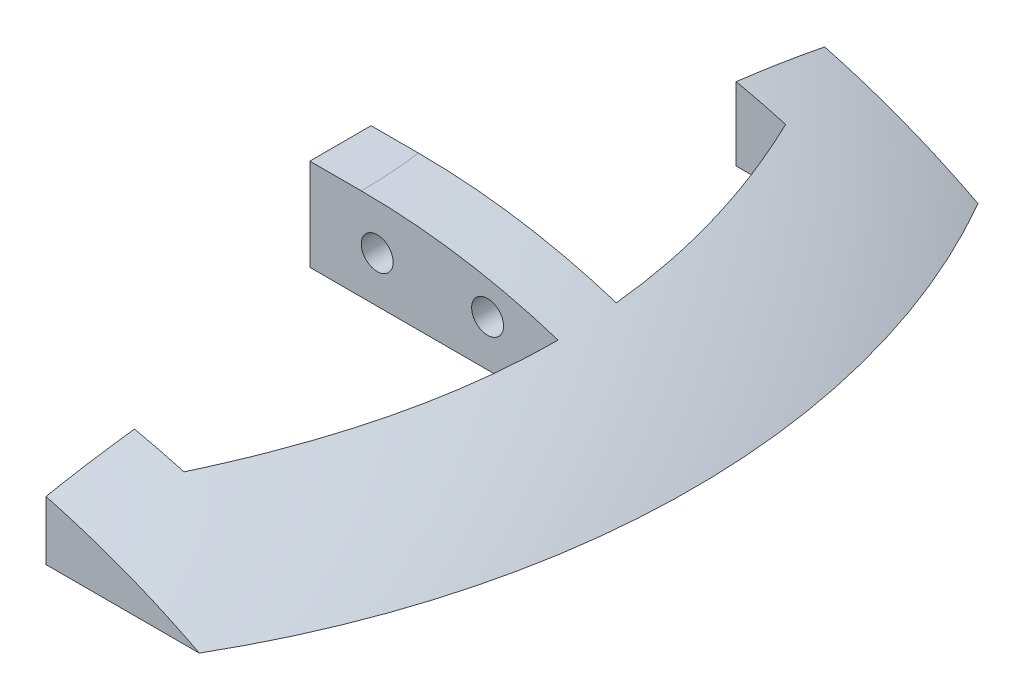
ISO-10303-21;
HEADER;
FILE_DESCRIPTION(('STEP AP214'),'2;1');
FILE_NAME('part.step','',(''),(''),'','','');
FILE_SCHEMA(('AUTOMOTIVE_DESIGN { 1 0 10303 214 1 1 1 1 }'));
ENDSEC;
DATA;
#1=APPLICATION_CONTEXT('core data for automotive mechanical design processes');
#2=APPLICATION_PROTOCOL_DEFINITION('international standard','automotive_design',2000,#1);
#3=PRODUCT_CONTEXT('',#1,'mechanical');
#4=PRODUCT('Part','Part','',(#3));
#5=PRODUCT_RELATED_PRODUCT_CATEGORY('part','',(#4));
#6=PRODUCT_DEFINITION_FORMATION('','',#4);
#7=PRODUCT_DEFINITION_CONTEXT('part definition',#1,'design');
#8=PRODUCT_DEFINITION('design','',#6,#7);
#9=PRODUCT_DEFINITION_SHAPE('','',#8);
#10=(LENGTH_UNIT() NAMED_UNIT(*) SI_UNIT(.MILLI.,.METRE.));
#11=(NAMED_UNIT(*) PLANE_ANGLE_UNIT() SI_UNIT($,.RADIAN.));
#12=(NAMED_UNIT(*) SI_UNIT($,.STERADIAN.) SOLID_ANGLE_UNIT());
#13=UNCERTAINTY_MEASURE_WITH_UNIT(LENGTH_MEASURE(1.E-05),#10,'distance_accuracy_value','');
#14=(GEOMETRIC_REPRESENTATION_CONTEXT(3) GLOBAL_UNCERTAINTY_ASSIGNED_CONTEXT((#13)) GLOBAL_UNIT_ASSIGNED_CONTEXT((#10,
#11,#12)) REPRESENTATION_CONTEXT('',''));
#15=CARTESIAN_POINT('',(0.,0.,0.));
#16=DIRECTION('',(0.,0.,1.));
#17=DIRECTION('',(1.,0.,0.));
#18=AXIS2_PLACEMENT_3D('',#15,#16,#17);
#19=CARTESIAN_POINT('',(84.9852262806236,7.5,-63.5000000000002));
#20=CARTESIAN_POINT('',(125.014773719376,7.5,0.));
#21=CARTESIAN_POINT('',(84.9852262806236,7.5,63.5000000000001));
#22=B_SPLINE_CURVE_WITH_KNOTS('',2,(#19,#20,#21),.UNSPECIFIED.,.F.,.F.,(3,3),(0.,1.),.UNSPECIFIED.);
#23=DIRECTION('',(0.,-1.,0.));
#24=VECTOR('',#23,1.);
#25=SURFACE_OF_LINEAR_EXTRUSION('',#22,#24);
#26=DIRECTION('',(0.,-1.,0.));
#27=VECTOR('',#26,1.);
#28=CARTESIAN_POINT('',(104.503632619015,7.5,-9.9999999999989));
#29=LINE('',#28,#27);
#30=CARTESIAN_POINT('',(104.503632619015,2.48441373684022,-9.9999999999989));
#31=VERTEX_POINT('',#30);
#32=CARTESIAN_POINT('',(104.503632619025,-7.5,-9.99999999999895));
#33=VERTEX_POINT('',#32);
#34=EDGE_CURVE('E151',#31,#33,#29,.T.);
#35=ORIENTED_EDGE('',*,*,#34,.F.);
#36=CARTESIAN_POINT('',(104.503632619015,2.48441373684022,-9.9999999999989));
#37=CARTESIAN_POINT('',(104.390389744491,2.48571221473044,-11.140998720779));
#38=CARTESIAN_POINT('',(104.257897177299,2.48718599004995,-12.2800663291533));
#39=CARTESIAN_POINT('',(103.955840658117,2.49030211867282,-14.5477913419774));
#40=CARTESIAN_POINT('',(103.78645513224,2.49194364108573,-15.6764725013471));
#41=CARTESIAN_POINT('',(103.411636465344,2.49522286994969,-17.9236105062914));
#42=CARTESIAN_POINT('',(103.206336499811,2.4968605686028,-19.0420895985374));
#43=CARTESIAN_POINT('',(102.760713583984,2.499922206327,-21.2690240618317));
#44=CARTESIAN_POINT('',(102.52048288119,2.50134668896419,-22.3774979102741));
#45=CARTESIAN_POINT('',(102.00597509761,2.50374974764146,-24.5846129565187));
#46=CARTESIAN_POINT('',(101.731753848475,2.50472904289542,-25.6832671823885));
#47=CARTESIAN_POINT('',(101.150208551283,2.50598656282114,-27.8709308051769));
#48=CARTESIAN_POINT('',(100.842908287548,2.5062652877487,-28.9599465306145));
#49=CARTESIAN_POINT('',(100.19636988574,2.50584663273234,-31.1276563387804));
#50=CARTESIAN_POINT('',(99.8571531585277,2.50514990286924,-32.2063568137616));
#51=CARTESIAN_POINT('',(99.1473966700136,2.50248841586823,-34.3546508875262));
#52=CARTESIAN_POINT('',(98.7768243402754,2.50052232586702,-35.4242337150406));
#53=CARTESIAN_POINT('',(98.0051363410381,2.49501070884452,-37.5545970072627));
#54=CARTESIAN_POINT('',(97.6039642706468,2.49146220383432,-38.6153570158611));
#55=CARTESIAN_POINT('',(96.7718142704585,2.48245652025253,-40.728365878104));
#56=CARTESIAN_POINT('',(96.3407598592072,2.47699428723105,-41.7805845679409));
#57=CARTESIAN_POINT('',(95.4495448489513,2.46381449411995,-43.8767824301222));
#58=CARTESIAN_POINT('',(94.9892910861479,2.45608939803481,-44.9207219020912));
#59=CARTESIAN_POINT('',(94.0403366346959,2.43801746232976,-47.0006402885018));
#60=CARTESIAN_POINT('',(93.5515291261471,2.42766021836603,-48.0365703963312));
#61=CARTESIAN_POINT('',(93.0499740227398,2.41582912009636,-49.0662432702595));
#62=B_SPLINE_CURVE_WITH_KNOTS('',3,(#36,#37,#38,#39,#40,#41,#42,#43,#44,#45,#46,#47,#48,#49,#50,
#51,#52,#53,#54,#55,#56,#57,#58,#59,#60,#61),.UNSPECIFIED.,.F.,.F.,(4,2,2,2,2,2,2,2,2,2,2,2,4),
(0.,3.43962300773555,6.86296634766363,10.2738746249455,13.6759334515574,17.0724764435548,
20.4665933783366,23.8584494186913,27.2538728070218,30.6557132777596,34.0666071192783,
37.4889919483117,40.9251210937083),.UNSPECIFIED.);
#63=CARTESIAN_POINT('',(93.0499740227399,2.4158291200964,-49.0662432702595));
#64=VERTEX_POINT('',#63);
#65=EDGE_CURVE('E196',#31,#64,#62,.T.);
#66=ORIENTED_EDGE('',*,*,#65,.T.);
#67=DIRECTION('',(0.,-1.,0.));
#68=VECTOR('',#67,1.);
#69=CARTESIAN_POINT('',(93.0499740227399,7.5,-49.0662432702595));
#70=LINE('',#69,#68);
#71=CARTESIAN_POINT('',(93.0499740227399,-7.5,-49.0662432702595));
#72=VERTEX_POINT('',#71);
#73=EDGE_CURVE('E257',#64,#72,#70,.T.);
#74=ORIENTED_EDGE('',*,*,#73,.T.);
#75=CARTESIAN_POINT('',(84.9852262806236,-7.5,-63.5000000000002));
#76=CARTESIAN_POINT('',(125.014773719376,-7.5,0.));
#77=CARTESIAN_POINT('',(84.9852262806236,-7.5,63.5000000000001));
#78=B_SPLINE_CURVE_WITH_KNOTS('',2,(#75,#76,#77),.UNSPECIFIED.,.F.,.F.,(3,3),(0.,1.),.UNSPECIFIED.);
#79=EDGE_CURVE('E277',#72,#33,#78,.T.);
#80=ORIENTED_EDGE('',*,*,#79,.T.);
#81=EDGE_LOOP('',(#35,#66,#74,#80));
#82=FACE_BOUND('',#81,.T.);
#83=ADVANCED_FACE('F43',(#82),#25,.F.);
#84=DIRECTION('',(0.,-1.,0.));
#85=VECTOR('',#84,1.);
#86=CARTESIAN_POINT('',(93.0499740227398,7.5,49.0662432702595));
#87=LINE('',#86,#85);
#88=CARTESIAN_POINT('',(93.0499740227398,2.41582912009641,49.0662432702595));
#89=VERTEX_POINT('',#88);
#90=CARTESIAN_POINT('',(93.0499740227398,-7.5,49.0662432702595));
#91=VERTEX_POINT('',#90);
#92=EDGE_CURVE('E259',#89,#91,#87,.T.);
#93=ORIENTED_EDGE('',*,*,#92,.F.);
#94=CARTESIAN_POINT('',(93.0499740227398,2.41582912009641,49.0662432702595));
#95=CARTESIAN_POINT('',(93.6533334452972,2.43006078895857,47.8275793431461));
#96=CARTESIAN_POINT('',(94.2382480620184,2.44216087762938,46.5798405828114));
#97=CARTESIAN_POINT('',(95.3700498328671,2.46270890973189,44.0643802169757));
#98=CARTESIAN_POINT('',(95.9168631098815,2.47114991512123,42.7966253328832));
#99=CARTESIAN_POINT('',(96.9696495326401,2.48494964981436,40.2424759308078));
#100=CARTESIAN_POINT('',(97.4755737741321,2.49030473384929,38.9560612012887));
#101=CARTESIAN_POINT('',(98.4439232559506,2.49849903994121,36.3660466746762));
#102=CARTESIAN_POINT('',(98.9063219196584,2.50133673367925,35.062436925071));
#103=CARTESIAN_POINT('',(99.7851443932491,2.50505262724196,32.4395457150232));
#104=CARTESIAN_POINT('',(100.201560578736,2.50593050256974,31.1202616956631));
#105=CARTESIAN_POINT('',(100.977648032057,2.50625709858714,28.4963387879553));
#106=CARTESIAN_POINT('',(101.338358373259,2.50573655518803,27.1920075365103));
#107=CARTESIAN_POINT('',(102.01163776609,2.50379977074594,24.5715754276408));
#108=CARTESIAN_POINT('',(102.324228003885,2.50238392529426,23.2554800213073));
#109=CARTESIAN_POINT('',(102.899576220004,2.49908378246816,20.6131872808588));
#110=CARTESIAN_POINT('',(103.16236172735,2.49719974522057,19.2869959513216));
#111=CARTESIAN_POINT('',(103.636661331644,2.49333782082038,16.6262495027311));
#112=CARTESIAN_POINT('',(103.848204331159,2.4913599873285,15.291699536076));
#113=CARTESIAN_POINT('',(104.218849596912,2.48762345191795,12.615949320621));
#114=CARTESIAN_POINT('',(104.377977753417,2.48586464208056,11.2747526882577));
#115=CARTESIAN_POINT('',(104.564534661689,2.4837106540263,9.38251039492222));
#116=CARTESIAN_POINT('',(104.614171788723,2.48312446575515,8.83358145136929));
#117=CARTESIAN_POINT('',(104.704517405748,2.48204046995378,7.73502640837808));
#118=CARTESIAN_POINT('',(104.745226626619,2.48154265518952,7.18540036971517));
#119=CARTESIAN_POINT('',(104.81767476036,2.48064617639166,6.08558269886346));
#120=CARTESIAN_POINT('',(104.849414053471,2.48024750815527,5.53539109164214));
#121=CARTESIAN_POINT('',(104.904039434714,2.47955562196695,4.43157157839854));
#122=CARTESIAN_POINT('',(104.926876493352,2.47926298861255,3.87794124135134));
#123=CARTESIAN_POINT('',(104.963426627302,2.47879242452521,2.77035736398427));
#124=CARTESIAN_POINT('',(104.977139338215,2.47861449837334,2.21640381164034));
#125=CARTESIAN_POINT('',(104.995427287465,2.47837649250804,1.10830026490391));
#126=CARTESIAN_POINT('',(105.00000177317,2.47831642250138,0.554150258090255));
#127=CARTESIAN_POINT('',(105.,2.47831685823799,1.01307850997046E-12));
#128=B_SPLINE_CURVE_WITH_KNOTS('',3,(#94,#95,#96,#97,#98,#99,#100,#101,#102,#103,#104,#105,#106,
#107,#108,#109,#110,#111,#112,#113,#114,#115,#116,#117,#118,#119,#120,#121,#122,#123,#124,#125,
#126,#127),.UNSPECIFIED.,.F.,.F.,(4,2,2,2,2,2,2,2,2,2,2,2,2,2,2,2,4),(0.,4.13355141038388,
8.27490658672612,12.4211437960752,16.5698964853992,20.7193360534659,24.7783251731021,
28.8355220710145,32.8904698152086,36.9431250734582,40.9937755136495,42.6472283266053,
44.3005457295538,45.9537930366418,47.6160212081274,49.2783157598877,50.9407472141019),.UNSPECIFIED.);
#129=CARTESIAN_POINT('',(104.99999999999,2.47831685824126,0.));
#130=VERTEX_POINT('',#129);
#131=EDGE_CURVE('E52',#89,#130,#128,.T.);
#132=ORIENTED_EDGE('',*,*,#131,.T.);
#133=DIRECTION('',(0.,-1.,0.));
#134=VECTOR('',#133,1.);
#135=CARTESIAN_POINT('',(104.99999999999,7.5,0.));
#136=LINE('',#135,#134);
#137=CARTESIAN_POINT('',(104.99999999999,-7.5,0.));
#138=VERTEX_POINT('',#137);
#139=EDGE_CURVE('E159',#130,#138,#136,.T.);
#140=ORIENTED_EDGE('',*,*,#139,.T.);
#141=EDGE_CURVE('E282',#138,#91,#78,.T.);
#142=ORIENTED_EDGE('',*,*,#141,.T.);
#143=EDGE_LOOP('',(#93,#132,#140,#142));
#144=FACE_BOUND('',#143,.T.);
#145=ADVANCED_FACE('F186',(#144),#25,.F.);
#146=CARTESIAN_POINT('',(0.,7.5,-63.5000000000003));
#147=DIRECTION('',(0.,0.,1.));
#148=DIRECTION('',(1.,0.,0.));
#149=AXIS2_PLACEMENT_3D('',#146,#147,#148);
#150=PLANE('',#149);
#151=DIRECTION('',(0.,-1.,0.));
#152=VECTOR('',#151,1.);
#153=CARTESIAN_POINT('',(84.9852262806236,7.5,-63.5000000000002));
#154=LINE('',#153,#152);
#155=CARTESIAN_POINT('',(84.9852262806236,2.12250484436396,-63.5000000000002));
#156=VERTEX_POINT('',#155);
#157=CARTESIAN_POINT('',(84.9852262806236,-7.5,-63.5000000000002));
#158=VERTEX_POINT('',#157);
#159=EDGE_CURVE('E253',#156,#158,#154,.T.);
#160=ORIENTED_EDGE('',*,*,#159,.F.);
#161=CARTESIAN_POINT('',(84.9852262806236,2.12250484436396,-63.5000000000002));
#162=CARTESIAN_POINT('',(86.0673435178037,1.83387649472302,-63.5000000000002));
#163=CARTESIAN_POINT('',(87.1458521247826,1.5316399665997,-63.5000000000002));
#164=CARTESIAN_POINT('',(89.2947643560905,0.89947032018981,-63.5000000000002));
#165=CARTESIAN_POINT('',(90.3651676592713,0.569536110661675,-63.5000000000002));
#166=CARTESIAN_POINT('',(92.493686156341,-0.11745042955623,-63.5000000000002));
#167=CARTESIAN_POINT('',(93.5518286487923,-0.474418099065195,-63.5000000000002));
#168=CARTESIAN_POINT('',(95.6581197445386,-1.21669464377797,-63.5000000000002));
#169=CARTESIAN_POINT('',(96.70626844441,-1.60200324479101,-63.5000000000002));
#170=CARTESIAN_POINT('',(98.7917850164171,-2.40132323332248,-63.5000000000002));
#171=CARTESIAN_POINT('',(99.8291509254306,-2.81533974570604,-63.5000000000002));
#172=CARTESIAN_POINT('',(101.891898950522,-3.67221892501526,-63.5000000000002));
#173=CARTESIAN_POINT('',(102.917281123695,-4.11508145444284,-63.5000000000002));
#174=CARTESIAN_POINT('',(104.958105420297,-5.03116641170143,-63.5000000000002));
#175=CARTESIAN_POINT('',(105.973508394399,-5.50447610679844,-63.5000000000002));
#176=CARTESIAN_POINT('',(107.990214429925,-6.48031504542773,-63.5000000000002));
#177=CARTESIAN_POINT('',(108.991517020692,-6.98284526145628,-63.5000000000002));
#178=CARTESIAN_POINT('',(109.985226280624,-7.49999999999998,-63.5000000000002));
#179=B_SPLINE_CURVE_WITH_KNOTS('',3,(#161,#162,#163,#164,#165,#166,#167,#168,#169,#170,#171,
#172,#173,#174,#175,#176,#177,#178),.UNSPECIFIED.,.F.,.F.,(4,2,2,2,2,2,2,2,4),(0.,
3.35978641277657,6.71970525760546,10.0695053903031,13.419273118862,16.7696403868939,
20.1199916861596,23.4804150042808,26.8409502256689),.UNSPECIFIED.);
#180=CARTESIAN_POINT('',(109.985226280624,-7.5,-63.5000000000002));
#181=VERTEX_POINT('',#180);
#182=EDGE_CURVE('E300',#156,#181,#179,.T.);
#183=ORIENTED_EDGE('',*,*,#182,.T.);
#184=DIRECTION('',(-1.,0.,0.));
#185=VECTOR('',#184,1.);
#186=CARTESIAN_POINT('',(0.,-7.5,-63.5000000000003));
#187=LINE('',#186,#185);
#188=EDGE_CURVE('E172',#181,#158,#187,.T.);
#189=ORIENTED_EDGE('',*,*,#188,.T.);
#190=EDGE_LOOP('',(#160,#183,#189));
#191=FACE_BOUND('',#190,.T.);
#192=ADVANCED_FACE('F298',(#191),#150,.F.);
#193=CARTESIAN_POINT('',(84.9852262806236,7.5,0.));
#194=DIRECTION('',(1.,0.,0.));
#195=DIRECTION('',(0.,0.,-1.));
#196=AXIS2_PLACEMENT_3D('',#193,#194,#195);
#197=PLANE('',#196);
#198=DIRECTION('',(0.,-1.,0.));
#199=VECTOR('',#198,1.);
#200=CARTESIAN_POINT('',(84.9852262806236,7.5,-49.0662432702595));
#201=LINE('',#200,#199);
#202=CARTESIAN_POINT('',(84.9852262806236,4.42725673668387,-49.0662432702595));
#203=VERTEX_POINT('',#202);
#204=CARTESIAN_POINT('',(84.9852262806236,-7.5,-49.0662432702595));
#205=VERTEX_POINT('',#204);
#206=EDGE_CURVE('E255',#203,#205,#201,.T.);
#207=ORIENTED_EDGE('',*,*,#206,.F.);
#208=CARTESIAN_POINT('',(84.9852262806236,4.42725673668387,-49.0662432702595));
#209=CARTESIAN_POINT('',(84.9852262806236,4.27767905395712,-50.2755226134372));
#210=CARTESIAN_POINT('',(84.9852262806236,4.11838221627253,-51.4836254858928));
#211=CARTESIAN_POINT('',(84.9852262806236,3.77903248572846,-53.8964901712186));
#212=CARTESIAN_POINT('',(84.9852262806236,3.59898665679471,-55.1012529789975));
#213=CARTESIAN_POINT('',(84.9852262806236,3.21671468476342,-57.5073141684525));
#214=CARTESIAN_POINT('',(84.9852262806236,3.0144877491762,-58.7086124247719));
#215=CARTESIAN_POINT('',(84.9852262806236,2.58648118719679,-61.1074220711234));
#216=CARTESIAN_POINT('',(84.9852262806236,2.36069358662157,-62.3049320367865));
#217=CARTESIAN_POINT('',(84.9852262806236,2.12250484436396,-63.5000000000002));
#218=B_SPLINE_CURVE_WITH_KNOTS('',3,(#208,#209,#210,#211,#212,#213,#214,#215,#216,#217),
.UNSPECIFIED.,.F.,.F.,(4,2,2,2,4),(0.,3.65548264269424,7.30972444448755,10.9640968480984,
14.6197101223374),.UNSPECIFIED.);
#219=EDGE_CURVE('E307',#203,#156,#218,.T.);
#220=ORIENTED_EDGE('',*,*,#219,.T.);
#221=ORIENTED_EDGE('',*,*,#159,.T.);
#222=DIRECTION('',(0.,0.,1.));
#223=VECTOR('',#222,1.);
#224=CARTESIAN_POINT('',(84.9852262806236,-7.5,0.));
#225=LINE('',#224,#223);
#226=EDGE_CURVE('E288',#158,#205,#225,.T.);
#227=ORIENTED_EDGE('',*,*,#226,.T.);
#228=EDGE_LOOP('',(#207,#220,#221,#227));
#229=FACE_BOUND('',#228,.T.);
#230=ADVANCED_FACE('F320',(#229),#197,.F.);
#231=CARTESIAN_POINT('',(0.,7.5,-49.0662432702595));
#232=DIRECTION('',(0.,0.,-1.));
#233=DIRECTION('',(-1.,0.,0.));
#234=AXIS2_PLACEMENT_3D('',#231,#232,#233);
#235=PLANE('',#234);
#236=ORIENTED_EDGE('',*,*,#73,.F.);
#237=CARTESIAN_POINT('',(93.0499740227399,2.4158291200964,-49.0662432702595));
#238=CARTESIAN_POINT('',(92.3837583995304,2.60620307928744,-49.0662432702595));
#239=CARTESIAN_POINT('',(91.7159055183498,2.79083871139055,-49.0662432702595));
#240=CARTESIAN_POINT('',(90.3773421753399,3.14866253226787,-49.0662432702595));
#241=CARTESIAN_POINT('',(89.7066325755399,3.32185394534205,-49.0662432702595));
#242=CARTESIAN_POINT('',(88.3623990805257,3.6569252783814,-49.0662432702595));
#243=CARTESIAN_POINT('',(87.6888752004986,3.81880525930444,-49.0662432702595));
#244=CARTESIAN_POINT('',(86.3390396332992,4.13139772850722,-49.0662432702595));
#245=CARTESIAN_POINT('',(85.6627272110417,4.28210704305838,-49.0662432702595));
#246=CARTESIAN_POINT('',(84.9852262806236,4.42725673668388,-49.0662432702595));
#247=B_SPLINE_CURVE_WITH_KNOTS('',3,(#237,#238,#239,#240,#241,#242,#243,#244,#245,#246),
.UNSPECIFIED.,.F.,.F.,(4,2,2,2,4),(0.,2.07861695613121,4.15664576247248,6.2346633693506,
8.31326912227673),.UNSPECIFIED.);
#248=EDGE_CURVE('E308',#64,#203,#247,.T.);
#249=ORIENTED_EDGE('',*,*,#248,.T.);
#250=ORIENTED_EDGE('',*,*,#206,.T.);
#251=DIRECTION('',(1.,0.,0.));
#252=VECTOR('',#251,1.);
#253=CARTESIAN_POINT('',(0.,-7.5,-49.0662432702595));
#254=LINE('',#253,#252);
#255=EDGE_CURVE('E283',#205,#72,#254,.T.);
#256=ORIENTED_EDGE('',*,*,#255,.T.);
#257=EDGE_LOOP('',(#236,#249,#250,#256));
#258=FACE_BOUND('',#257,.T.);
#259=ADVANCED_FACE('F191',(#258),#235,.F.);
#260=CARTESIAN_POINT('',(0.,7.5,49.0662432702593));
#261=DIRECTION('',(0.,0.,-1.));
#262=DIRECTION('',(-1.,0.,0.));
#263=AXIS2_PLACEMENT_3D('',#260,#261,#262);
#264=PLANE('',#263);
#265=DIRECTION('',(0.,-1.,0.));
#266=VECTOR('',#265,1.);
#267=CARTESIAN_POINT('',(84.9852262806237,7.5,49.0662432702595));
#268=LINE('',#267,#266);
#269=CARTESIAN_POINT('',(84.9852262806237,4.42725673668387,49.0662432702595));
#270=VERTEX_POINT('',#269);
#271=CARTESIAN_POINT('',(84.9852262806237,-7.5,49.0662432702595));
#272=VERTEX_POINT('',#271);
#273=EDGE_CURVE('E261',#270,#272,#268,.T.);
#274=ORIENTED_EDGE('',*,*,#273,.F.);
#275=CARTESIAN_POINT('',(84.9852262806237,4.42725673668387,49.0662432702595));
#276=CARTESIAN_POINT('',(85.6627272110418,4.28210704305837,49.0662432702595));
#277=CARTESIAN_POINT('',(86.3390396332993,4.13139772850722,49.0662432702595));
#278=CARTESIAN_POINT('',(87.6888752004986,3.81880525930444,49.0662432702595));
#279=CARTESIAN_POINT('',(88.3623990805257,3.6569252783814,49.0662432702595));
#280=CARTESIAN_POINT('',(89.7066325755399,3.32185394534205,49.0662432702595));
#281=CARTESIAN_POINT('',(90.3773421753399,3.14866253226787,49.0662432702595));
#282=CARTESIAN_POINT('',(91.7159055183498,2.79083871139056,49.0662432702595));
#283=CARTESIAN_POINT('',(92.3837583995304,2.60620307928744,49.0662432702595));
#284=CARTESIAN_POINT('',(93.0499740227398,2.41582912009641,49.0662432702595));
#285=B_SPLINE_CURVE_WITH_KNOTS('',3,(#275,#276,#277,#278,#279,#280,#281,#282,#283,#284),
.UNSPECIFIED.,.F.,.F.,(4,2,2,2,4),(0.,2.07860575292609,4.1566233598042,6.23465216614544,
8.31326912227662),.UNSPECIFIED.);
#286=EDGE_CURVE('E66',#270,#89,#285,.T.);
#287=ORIENTED_EDGE('',*,*,#286,.T.);
#288=ORIENTED_EDGE('',*,*,#92,.T.);
#289=DIRECTION('',(1.,0.,0.));
#290=VECTOR('',#289,1.);
#291=CARTESIAN_POINT('',(0.,-7.5,49.0662432702593));
#292=LINE('',#291,#290);
#293=EDGE_CURVE('E274',#272,#91,#292,.T.);
#294=ORIENTED_EDGE('',*,*,#293,.F.);
#295=EDGE_LOOP('',(#274,#287,#288,#294));
#296=FACE_BOUND('',#295,.T.);
#297=ADVANCED_FACE('F188',(#296),#264,.T.);
#298=CARTESIAN_POINT('',(84.9852262806238,7.5,1.63423419031503E-13));
#299=DIRECTION('',(-1.,0.,0.));
#300=DIRECTION('',(0.,0.,1.));
#301=AXIS2_PLACEMENT_3D('',#298,#299,#300);
#302=PLANE('',#301);
#303=DIRECTION('',(0.,-1.,0.));
#304=VECTOR('',#303,1.);
#305=CARTESIAN_POINT('',(84.9852262806236,7.5,63.5000000000001));
#306=LINE('',#305,#304);
#307=CARTESIAN_POINT('',(84.9852262806236,2.12250484436396,63.5000000000001));
#308=VERTEX_POINT('',#307);
#309=CARTESIAN_POINT('',(84.9852262806236,-7.5,63.5000000000001));
#310=VERTEX_POINT('',#309);
#311=EDGE_CURVE('E263',#308,#310,#306,.T.);
#312=ORIENTED_EDGE('',*,*,#311,.F.);
#313=CARTESIAN_POINT('',(84.9852262806236,2.12250484436396,63.5000000000001));
#314=CARTESIAN_POINT('',(84.9852262806236,2.36069358662157,62.3049320367864));
#315=CARTESIAN_POINT('',(84.9852262806236,2.58648118719679,61.1074220711234));
#316=CARTESIAN_POINT('',(84.9852262806236,3.0144877491762,58.7086124247719));
#317=CARTESIAN_POINT('',(84.9852262806236,3.21671468476343,57.5073141684525));
#318=CARTESIAN_POINT('',(84.9852262806236,3.59898665679471,55.1012529789975));
#319=CARTESIAN_POINT('',(84.9852262806237,3.77903248572845,53.8964901712186));
#320=CARTESIAN_POINT('',(84.9852262806237,4.11838221627251,51.4836254858928));
#321=CARTESIAN_POINT('',(84.9852262806237,4.27767905395708,50.2755226134372));
#322=CARTESIAN_POINT('',(84.9852262806237,4.42725673668385,49.0662432702595));
#323=B_SPLINE_CURVE_WITH_KNOTS('',3,(#313,#314,#315,#316,#317,#318,#319,#320,#321,#322),
.UNSPECIFIED.,.F.,.F.,(4,2,2,2,4),(0.,3.65561327423894,7.30998567784977,10.9642274796431,
14.6197101223373),.UNSPECIFIED.);
#324=EDGE_CURVE('E213',#308,#270,#323,.T.);
#325=ORIENTED_EDGE('',*,*,#324,.T.);
#326=ORIENTED_EDGE('',*,*,#273,.T.);
#327=DIRECTION('',(0.,0.,-1.));
#328=VECTOR('',#327,1.);
#329=CARTESIAN_POINT('',(84.9852262806238,-7.5,1.63423419031503E-13));
#330=LINE('',#329,#328);
#331=EDGE_CURVE('E271',#310,#272,#330,.T.);
#332=ORIENTED_EDGE('',*,*,#331,.F.);
#333=EDGE_LOOP('',(#312,#325,#326,#332));
#334=FACE_BOUND('',#333,.T.);
#335=ADVANCED_FACE('F226',(#334),#302,.T.);
#336=CARTESIAN_POINT('',(0.,7.5,63.5000000000001));
#337=DIRECTION('',(0.,0.,1.));
#338=DIRECTION('',(1.,0.,0.));
#339=AXIS2_PLACEMENT_3D('',#336,#337,#338);
#340=PLANE('',#339);
#341=DIRECTION('',(-1.,0.,0.));
#342=VECTOR('',#341,1.);
#343=CARTESIAN_POINT('',(0.,-7.5,63.5000000000001));
#344=LINE('',#343,#342);
#345=CARTESIAN_POINT('',(109.985226280624,-7.5,63.5000000000001));
#346=VERTEX_POINT('',#345);
#347=EDGE_CURVE('E268',#346,#310,#344,.T.);
#348=ORIENTED_EDGE('',*,*,#347,.F.);
#349=CARTESIAN_POINT('',(109.985226280624,-7.5,63.5000000000001));
#350=CARTESIAN_POINT('',(108.991517020692,-6.98284526145628,63.5000000000001));
#351=CARTESIAN_POINT('',(107.990214429925,-6.48031504542772,63.5000000000001));
#352=CARTESIAN_POINT('',(105.973508394399,-5.50447610679844,63.5000000000001));
#353=CARTESIAN_POINT('',(104.958105420297,-5.03116641170143,63.5000000000001));
#354=CARTESIAN_POINT('',(102.917281123695,-4.11508145444284,63.5000000000001));
#355=CARTESIAN_POINT('',(101.891898950523,-3.67221892501525,63.5000000000001));
#356=CARTESIAN_POINT('',(99.8291509254307,-2.81533974570604,63.5000000000001));
#357=CARTESIAN_POINT('',(98.7917850164171,-2.40132323332247,63.5000000000001));
#358=CARTESIAN_POINT('',(96.70626844441,-1.602003244791,63.5000000000001));
#359=CARTESIAN_POINT('',(95.6581197445386,-1.21669464377796,63.5000000000001));
#360=CARTESIAN_POINT('',(93.5518286487924,-0.474418099065187,63.5000000000001));
#361=CARTESIAN_POINT('',(92.4936861563411,-0.117450429556224,63.5000000000001));
#362=CARTESIAN_POINT('',(90.3651676592713,0.569536110661678,63.5000000000001));
#363=CARTESIAN_POINT('',(89.2947643560905,0.899470320189814,63.5000000000001));
#364=CARTESIAN_POINT('',(87.1458521247827,1.5316399665997,63.5000000000001));
#365=CARTESIAN_POINT('',(86.0673435178037,1.83387649472302,63.5000000000001));
#366=CARTESIAN_POINT('',(84.9852262806236,2.12250484436396,63.5000000000001));
#367=B_SPLINE_CURVE_WITH_KNOTS('',3,(#349,#350,#351,#352,#353,#354,#355,#356,#357,#358,#359,
#360,#361,#362,#363,#364,#365,#366),.UNSPECIFIED.,.F.,.F.,(4,2,2,2,2,2,2,2,4),(0.,
3.36053522138807,6.72095853950932,10.0713098387749,13.4216771068069,16.7714448353658,
20.1212449680634,23.4811638128923,26.8409502256689),.UNSPECIFIED.);
#368=EDGE_CURVE('E219',#346,#308,#367,.T.);
#369=ORIENTED_EDGE('',*,*,#368,.T.);
#370=ORIENTED_EDGE('',*,*,#311,.T.);
#371=EDGE_LOOP('',(#348,#369,#370));
#372=FACE_BOUND('',#371,.T.);
#373=ADVANCED_FACE('F229',(#372),#340,.T.);
#374=CARTESIAN_POINT('',(0.,7.5,0.));
#375=DIRECTION('',(0.,1.,0.));
#376=DIRECTION('',(0.,0.,1.));
#377=AXIS2_PLACEMENT_3D('',#374,#375,#376);
#378=PLANE('',#377);
#379=DIRECTION('',(1.,0.,0.));
#380=VECTOR('',#379,1.);
#381=CARTESIAN_POINT('',(0.,7.5,0.));
#382=LINE('',#381,#380);
#383=CARTESIAN_POINT('',(64.5036326190146,7.5,0.));
#384=VERTEX_POINT('',#383);
#385=CARTESIAN_POINT('',(72.9167308680401,7.50000000000001,0.));
#386=VERTEX_POINT('',#385);
#387=EDGE_CURVE('E157',#384,#386,#382,.T.);
#388=ORIENTED_EDGE('',*,*,#387,.T.);
#389=CARTESIAN_POINT('',(0.,7.50000000000001,0.));
#390=DIRECTION('',(0.,1.,0.));
#391=DIRECTION('',(0.,0.,1.));
#392=AXIS2_PLACEMENT_3D('',#389,#390,#391);
#393=CIRCLE('',#392,72.9167308680401);
#394=CARTESIAN_POINT('',(72.2277622558127,7.5,-9.99999999999979));
#395=VERTEX_POINT('',#394);
#396=EDGE_CURVE('E140',#386,#395,#393,.T.);
#397=ORIENTED_EDGE('',*,*,#396,.T.);
#398=DIRECTION('',(-1.,0.,0.));
#399=VECTOR('',#398,1.);
#400=CARTESIAN_POINT('',(2.77122075287345E-13,7.5,-10.0000000000018));
#401=LINE('',#400,#399);
#402=CARTESIAN_POINT('',(64.5036326190146,7.5,-10.));
#403=VERTEX_POINT('',#402);
#404=EDGE_CURVE('E132',#395,#403,#401,.T.);
#405=ORIENTED_EDGE('',*,*,#404,.T.);
#406=DIRECTION('',(0.,0.,1.));
#407=VECTOR('',#406,1.);
#408=CARTESIAN_POINT('',(64.5036326190146,7.5,0.));
#409=LINE('',#408,#407);
#410=EDGE_CURVE('E137',#403,#384,#409,.T.);
#411=ORIENTED_EDGE('',*,*,#410,.T.);
#412=EDGE_LOOP('',(#388,#397,#405,#411));
#413=FACE_BOUND('',#412,.T.);
#414=ADVANCED_FACE('F135',(#413),#378,.T.);
#415=CARTESIAN_POINT('',(0.,-7.5,0.));
#416=DIRECTION('',(0.,1.,0.));
#417=DIRECTION('',(0.,0.,1.));
#418=AXIS2_PLACEMENT_3D('',#415,#416,#417);
#419=PLANE('',#418);
#420=ORIENTED_EDGE('',*,*,#188,.F.);
#421=CARTESIAN_POINT('',(0.,-7.5,0.));
#422=DIRECTION('',(0.,1.,0.));
#423=DIRECTION('',(0.,0.,1.));
#424=AXIS2_PLACEMENT_3D('',#421,#422,#423);
#425=CIRCLE('',#424,127.);
#426=EDGE_CURVE('E265',#346,#181,#425,.T.);
#427=ORIENTED_EDGE('',*,*,#426,.F.);
#428=ORIENTED_EDGE('',*,*,#347,.T.);
#429=ORIENTED_EDGE('',*,*,#331,.T.);
#430=ORIENTED_EDGE('',*,*,#293,.T.);
#431=ORIENTED_EDGE('',*,*,#141,.F.);
#432=DIRECTION('',(1.,0.,0.));
#433=VECTOR('',#432,1.);
#434=CARTESIAN_POINT('',(0.,-7.5,0.));
#435=LINE('',#434,#433);
#436=CARTESIAN_POINT('',(64.5036326190146,-7.5,0.));
#437=VERTEX_POINT('',#436);
#438=EDGE_CURVE('E142',#437,#138,#435,.T.);
#439=ORIENTED_EDGE('',*,*,#438,.F.);
#440=DIRECTION('',(0.,0.,1.));
#441=VECTOR('',#440,1.);
#442=CARTESIAN_POINT('',(64.5036326190146,-7.5,0.));
#443=LINE('',#442,#441);
#444=CARTESIAN_POINT('',(64.5036326190146,-7.5,-10.));
#445=VERTEX_POINT('',#444);
#446=EDGE_CURVE('E164',#445,#437,#443,.T.);
#447=ORIENTED_EDGE('',*,*,#446,.F.);
#448=DIRECTION('',(-1.,0.,0.));
#449=VECTOR('',#448,1.);
#450=CARTESIAN_POINT('',(2.77122075287345E-13,-7.5,-10.0000000000018));
#451=LINE('',#450,#449);
#452=EDGE_CURVE('E148',#33,#445,#451,.T.);
#453=ORIENTED_EDGE('',*,*,#452,.F.);
#454=ORIENTED_EDGE('',*,*,#79,.F.);
#455=ORIENTED_EDGE('',*,*,#255,.F.);
#456=ORIENTED_EDGE('',*,*,#226,.F.);
#457=EDGE_LOOP('',(#420,#427,#428,#429,#430,#431,#439,#447,#453,#454,#455,#456));
#458=FACE_BOUND('',#457,.T.);
#459=ADVANCED_FACE('F235',(#458),#419,.F.);
#460=CARTESIAN_POINT('',(2.77122075287345E-13,7.5,-10.0000000000018));
#461=DIRECTION('',(0.,0.,1.));
#462=DIRECTION('',(1.,0.,0.));
#463=AXIS2_PLACEMENT_3D('',#460,#461,#462);
#464=PLANE('',#463);
#465=CARTESIAN_POINT('',(75.5036326190197,0.,-10.0000000000018));
#466=DIRECTION('',(0.,0.,-1.));
#467=DIRECTION('',(-1.,0.,0.));
#468=AXIS2_PLACEMENT_3D('',#465,#466,#467);
#469=CIRCLE('',#468,2.6);
#470=CARTESIAN_POINT('',(72.9036326190197,0.,-10.0000000000018));
#471=VERTEX_POINT('',#470);
#472=EDGE_CURVE('E477',#471,#471,#469,.T.);
#473=ORIENTED_EDGE('',*,*,#472,.F.);
#474=EDGE_LOOP('',(#473));
#475=FACE_BOUND('',#474,.T.);
#476=CARTESIAN_POINT('',(93.5036326190197,0.,-10.0000000000018));
#477=DIRECTION('',(0.,0.,-1.));
#478=DIRECTION('',(-1.,0.,0.));
#479=AXIS2_PLACEMENT_3D('',#476,#477,#478);
#480=CIRCLE('',#479,2.59999999999999);
#481=CARTESIAN_POINT('',(90.9036326190197,0.,-10.0000000000018));
#482=VERTEX_POINT('',#481);
#483=EDGE_CURVE('E478',#482,#482,#480,.T.);
#484=ORIENTED_EDGE('',*,*,#483,.F.);
#485=EDGE_LOOP('',(#484));
#486=FACE_BOUND('',#485,.T.);
#487=ORIENTED_EDGE('',*,*,#404,.F.);
#488=CARTESIAN_POINT('',(72.2277622558127,7.5,-9.99999999999979));
#489=CARTESIAN_POINT('',(73.5981994009112,7.50001894376804,-9.99999999999975));
#490=CARTESIAN_POINT('',(74.9686421986203,7.47367508134512,-9.99999999999972));
#491=CARTESIAN_POINT('',(77.7075025989519,7.36823016058402,-9.99999999999964));
#492=CARTESIAN_POINT('',(79.0759201917381,7.28912884684546,-9.9999999999996));
#493=CARTESIAN_POINT('',(81.8005713305475,7.07876352348843,-9.99999999999953));
#494=CARTESIAN_POINT('',(83.1568289886948,6.9478118693218,-9.99999999999949));
#495=CARTESIAN_POINT('',(85.863299864194,6.63384026109182,-9.99999999999941));
#496=CARTESIAN_POINT('',(87.2135131056773,6.45082051509132,-9.99999999999938));
#497=CARTESIAN_POINT('',(89.9059334497501,6.03288693093674,-9.9999999999993));
#498=CARTESIAN_POINT('',(91.2481402718086,5.79797128528236,-9.99999999999926));
#499=CARTESIAN_POINT('',(93.9224929645951,5.27652624760797,-9.99999999999919));
#500=CARTESIAN_POINT('',(95.2546388191843,4.98999677281197,-9.99999999999915));
#501=CARTESIAN_POINT('',(97.9147823282906,4.36382007745635,-9.99999999999908));
#502=CARTESIAN_POINT('',(99.2427077809245,4.02386605959648,-9.99999999999904));
#503=CARTESIAN_POINT('',(101.884341100317,3.29256502103045,-9.99999999999897));
#504=CARTESIAN_POINT('',(103.198048862935,2.90121762415733,-9.99999999999893));
#505=CARTESIAN_POINT('',(104.503632619015,2.48441373684022,-9.9999999999989));
#506=B_SPLINE_CURVE_WITH_KNOTS('',3,(#488,#489,#490,#491,#492,#493,#494,#495,#496,#497,#498,
#499,#500,#501,#502,#503,#504,#505),.UNSPECIFIED.,.F.,.F.,(4,2,2,2,2,2,2,2,4),(0.,
4.11106685547214,8.2221536128851,12.3088423424438,16.3955147419205,20.4823294999753,
24.5691508123417,28.6803619388463,32.7916031584899),.UNSPECIFIED.);
#507=EDGE_CURVE('E246',#395,#31,#506,.T.);
#508=ORIENTED_EDGE('',*,*,#507,.T.);
#509=ORIENTED_EDGE('',*,*,#34,.T.);
#510=ORIENTED_EDGE('',*,*,#452,.T.);
#511=DIRECTION('',(0.,-1.,0.));
#512=VECTOR('',#511,1.);
#513=CARTESIAN_POINT('',(64.5036326190146,7.5,-10.));
#514=LINE('',#513,#512);
#515=EDGE_CURVE('E145',#403,#445,#514,.T.);
#516=ORIENTED_EDGE('',*,*,#515,.F.);
#517=EDGE_LOOP('',(#487,#508,#509,#510,#516));
#518=FACE_BOUND('',#517,.T.);
#519=ADVANCED_FACE('F146',(#475,#486,#518),#464,.F.);
#520=CARTESIAN_POINT('',(64.5036326190146,7.5,0.));
#521=DIRECTION('',(1.,0.,0.));
#522=DIRECTION('',(0.,0.,-1.));
#523=AXIS2_PLACEMENT_3D('',#520,#521,#522);
#524=PLANE('',#523);
#525=ORIENTED_EDGE('',*,*,#446,.T.);
#526=DIRECTION('',(0.,-1.,0.));
#527=VECTOR('',#526,1.);
#528=CARTESIAN_POINT('',(64.5036326190146,7.5,0.));
#529=LINE('',#528,#527);
#530=EDGE_CURVE('E152',#384,#437,#529,.T.);
#531=ORIENTED_EDGE('',*,*,#530,.F.);
#532=ORIENTED_EDGE('',*,*,#410,.F.);
#533=ORIENTED_EDGE('',*,*,#515,.T.);
#534=EDGE_LOOP('',(#525,#531,#532,#533));
#535=FACE_BOUND('',#534,.T.);
#536=ADVANCED_FACE('F154',(#535),#524,.F.);
#537=CARTESIAN_POINT('',(0.,7.5,0.));
#538=DIRECTION('',(0.,0.,-1.));
#539=DIRECTION('',(-1.,0.,0.));
#540=AXIS2_PLACEMENT_3D('',#537,#538,#539);
#541=PLANE('',#540);
#542=CARTESIAN_POINT('',(75.5036326190197,0.,-1.76421377506841E-12));
#543=DIRECTION('',(0.,0.,-1.));
#544=DIRECTION('',(-1.,0.,0.));
#545=AXIS2_PLACEMENT_3D('',#542,#543,#544);
#546=CIRCLE('',#545,2.6);
#547=CARTESIAN_POINT('',(72.9036326190197,0.,-1.76522858830186E-12));
#548=VERTEX_POINT('',#547);
#549=EDGE_CURVE('E165',#548,#548,#546,.T.);
#550=ORIENTED_EDGE('',*,*,#549,.T.);
#551=EDGE_LOOP('',(#550));
#552=FACE_BOUND('',#551,.T.);
#553=CARTESIAN_POINT('',(93.5036326190197,0.,-1.75727488116451E-12));
#554=DIRECTION('',(0.,0.,-1.));
#555=DIRECTION('',(-1.,0.,0.));
#556=AXIS2_PLACEMENT_3D('',#553,#554,#555);
#557=CIRCLE('',#556,2.59999999999999);
#558=CARTESIAN_POINT('',(90.9036326190197,0.,-1.75828969439795E-12));
#559=VERTEX_POINT('',#558);
#560=EDGE_CURVE('E482',#559,#559,#557,.T.);
#561=ORIENTED_EDGE('',*,*,#560,.T.);
#562=EDGE_LOOP('',(#561));
#563=FACE_BOUND('',#562,.T.);
#564=ORIENTED_EDGE('',*,*,#139,.F.);
#565=CARTESIAN_POINT('',(72.9167308680401,-97.5,0.));
#566=DIRECTION('',(0.,0.,-1.));
#567=DIRECTION('',(-1.,0.,0.));
#568=AXIS2_PLACEMENT_3D('',#565,#566,#567);
#569=CIRCLE('',#568,105.);
#570=EDGE_CURVE('E11',#130,#386,#569,.F.);
#571=ORIENTED_EDGE('',*,*,#570,.T.);
#572=ORIENTED_EDGE('',*,*,#387,.F.);
#573=ORIENTED_EDGE('',*,*,#530,.T.);
#574=ORIENTED_EDGE('',*,*,#438,.T.);
#575=EDGE_LOOP('',(#564,#571,#572,#573,#574));
#576=FACE_BOUND('',#575,.T.);
#577=ADVANCED_FACE('F339',(#552,#563,#576),#541,.F.);
#578=CARTESIAN_POINT('',(0.,-97.5,0.));
#579=DIRECTION('',(0.,-1.,0.));
#580=DIRECTION('',(0.,0.,-1.));
#581=AXIS2_PLACEMENT_3D('',#578,#579,#580);
#582=DEGENERATE_TOROIDAL_SURFACE('',#581,72.9167308680401,105.,.T.);
#583=ORIENTED_EDGE('',*,*,#368,.F.);
#584=ORIENTED_EDGE('',*,*,#426,.T.);
#585=ORIENTED_EDGE('',*,*,#182,.F.);
#586=ORIENTED_EDGE('',*,*,#219,.F.);
#587=ORIENTED_EDGE('',*,*,#248,.F.);
#588=ORIENTED_EDGE('',*,*,#65,.F.);
#589=ORIENTED_EDGE('',*,*,#507,.F.);
#590=ORIENTED_EDGE('',*,*,#396,.F.);
#591=ORIENTED_EDGE('',*,*,#570,.F.);
#592=ORIENTED_EDGE('',*,*,#131,.F.);
#593=ORIENTED_EDGE('',*,*,#286,.F.);
#594=ORIENTED_EDGE('',*,*,#324,.F.);
#595=EDGE_LOOP('',(#583,#584,#585,#586,#587,#588,#589,#590,#591,#592,#593,#594));
#596=FACE_BOUND('',#595,.T.);
#597=ADVANCED_FACE('F45',(#596),#582,.T.);
#598=CARTESIAN_POINT('',(93.5036326190197,0.,-1.75727488116451E-12));
#599=DIRECTION('',(0.,0.,-1.));
#600=DIRECTION('',(-1.,0.,0.));
#601=AXIS2_PLACEMENT_3D('',#598,#599,#600);
#602=CYLINDRICAL_SURFACE('',#601,2.59999999999999);
#603=ORIENTED_EDGE('',*,*,#560,.F.);
#604=EDGE_LOOP('',(#603));
#605=FACE_BOUND('',#604,.T.);
#606=ORIENTED_EDGE('',*,*,#483,.T.);
#607=EDGE_LOOP('',(#606));
#608=FACE_BOUND('',#607,.T.);
#609=ADVANCED_FACE('F379',(#605,#608),#602,.F.);
#610=CARTESIAN_POINT('',(75.5036326190197,0.,-1.76421377506841E-12));
#611=DIRECTION('',(0.,0.,-1.));
#612=DIRECTION('',(-1.,0.,0.));
#613=AXIS2_PLACEMENT_3D('',#610,#611,#612);
#614=CYLINDRICAL_SURFACE('',#613,2.6);
#615=ORIENTED_EDGE('',*,*,#549,.F.);
#616=EDGE_LOOP('',(#615));
#617=FACE_BOUND('',#616,.T.);
#618=ORIENTED_EDGE('',*,*,#472,.T.);
#619=EDGE_LOOP('',(#618));
#620=FACE_BOUND('',#619,.T.);
#621=ADVANCED_FACE('F400',(#617,#620),#614,.F.);
#622=CLOSED_SHELL('',(#83,#145,#192,#230,#259,#297,#335,#373,#414,#459,#519,#536,#577,#597,#609,#621));
#623=MANIFOLD_SOLID_BREP('B2',#622);
#624=ADVANCED_BREP_SHAPE_REPRESENTATION('',(#18,#623),#14);
#625=SHAPE_DEFINITION_REPRESENTATION(#9,#624);
ENDSEC;
END-ISO-10303-21;
